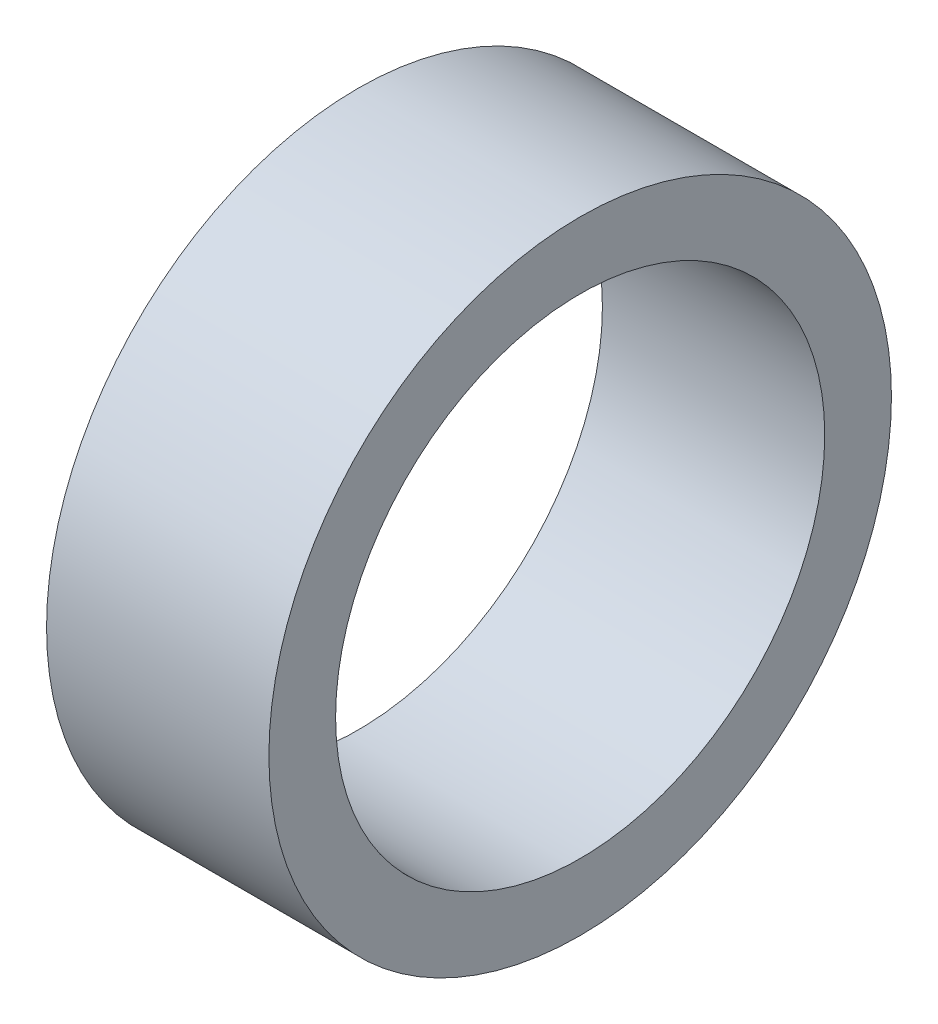
ISO-10303-21;
HEADER;
FILE_DESCRIPTION(('STEP AP214'),'2;1');
FILE_NAME('part.step','',(''),(''),'','','');
FILE_SCHEMA(('AUTOMOTIVE_DESIGN { 1 0 10303 214 1 1 1 1 }'));
ENDSEC;
DATA;
#1=APPLICATION_CONTEXT('core data for automotive mechanical design processes');
#2=APPLICATION_PROTOCOL_DEFINITION('international standard','automotive_design',2000,#1);
#3=PRODUCT_CONTEXT('',#1,'mechanical');
#4=PRODUCT('Part','Part','',(#3));
#5=PRODUCT_RELATED_PRODUCT_CATEGORY('part','',(#4));
#6=PRODUCT_DEFINITION_FORMATION('','',#4);
#7=PRODUCT_DEFINITION_CONTEXT('part definition',#1,'design');
#8=PRODUCT_DEFINITION('design','',#6,#7);
#9=PRODUCT_DEFINITION_SHAPE('','',#8);
#10=(LENGTH_UNIT() NAMED_UNIT(*) SI_UNIT(.MILLI.,.METRE.));
#11=(NAMED_UNIT(*) PLANE_ANGLE_UNIT() SI_UNIT($,.RADIAN.));
#12=(NAMED_UNIT(*) SI_UNIT($,.STERADIAN.) SOLID_ANGLE_UNIT());
#13=UNCERTAINTY_MEASURE_WITH_UNIT(LENGTH_MEASURE(1.E-05),#10,'distance_accuracy_value','');
#14=(GEOMETRIC_REPRESENTATION_CONTEXT(3) GLOBAL_UNCERTAINTY_ASSIGNED_CONTEXT((#13)) GLOBAL_UNIT_ASSIGNED_CONTEXT((#10,
#11,#12)) REPRESENTATION_CONTEXT('',''));
#15=CARTESIAN_POINT('',(0.,0.,0.));
#16=DIRECTION('',(0.,0.,1.));
#17=DIRECTION('',(1.,0.,0.));
#18=AXIS2_PLACEMENT_3D('',#15,#16,#17);
#19=CARTESIAN_POINT('',(3.175,0.,0.));
#20=DIRECTION('',(1.,0.,0.));
#21=DIRECTION('',(0.,0.,-1.));
#22=AXIS2_PLACEMENT_3D('',#19,#20,#21);
#23=PLANE('',#22);
#24=CARTESIAN_POINT('',(3.175,0.,0.));
#25=DIRECTION('',(1.,0.,0.));
#26=DIRECTION('',(0.,0.,-1.));
#27=AXIS2_PLACEMENT_3D('',#24,#25,#26);
#28=CIRCLE('',#27,4.445);
#29=CARTESIAN_POINT('',(3.175,0.,-4.445));
#30=VERTEX_POINT('',#29);
#31=EDGE_CURVE('E12',#30,#30,#28,.T.);
#32=ORIENTED_EDGE('',*,*,#31,.T.);
#33=EDGE_LOOP('',(#32));
#34=FACE_BOUND('',#33,.T.);
#35=CARTESIAN_POINT('',(3.175,0.,0.));
#36=DIRECTION('',(1.,0.,0.));
#37=DIRECTION('',(0.,0.,-1.));
#38=AXIS2_PLACEMENT_3D('',#35,#36,#37);
#39=CIRCLE('',#38,3.4925);
#40=CARTESIAN_POINT('',(3.175,0.,-3.4925));
#41=VERTEX_POINT('',#40);
#42=EDGE_CURVE('E51',#41,#41,#39,.T.);
#43=ORIENTED_EDGE('',*,*,#42,.F.);
#44=EDGE_LOOP('',(#43));
#45=FACE_BOUND('',#44,.T.);
#46=ADVANCED_FACE('F40',(#34,#45),#23,.T.);
#47=CARTESIAN_POINT('',(0.,0.,0.));
#48=DIRECTION('',(1.,0.,0.));
#49=DIRECTION('',(0.,0.,-1.));
#50=AXIS2_PLACEMENT_3D('',#47,#48,#49);
#51=PLANE('',#50);
#52=CARTESIAN_POINT('',(0.,0.,0.));
#53=DIRECTION('',(1.,0.,0.));
#54=DIRECTION('',(0.,0.,-1.));
#55=AXIS2_PLACEMENT_3D('',#52,#53,#54);
#56=CIRCLE('',#55,4.445);
#57=CARTESIAN_POINT('',(0.,0.,-4.445));
#58=VERTEX_POINT('',#57);
#59=EDGE_CURVE('E44',#58,#58,#56,.T.);
#60=ORIENTED_EDGE('',*,*,#59,.F.);
#61=EDGE_LOOP('',(#60));
#62=FACE_BOUND('',#61,.T.);
#63=CARTESIAN_POINT('',(0.,0.,0.));
#64=DIRECTION('',(1.,0.,0.));
#65=DIRECTION('',(0.,0.,-1.));
#66=AXIS2_PLACEMENT_3D('',#63,#64,#65);
#67=CIRCLE('',#66,3.4925);
#68=CARTESIAN_POINT('',(0.,0.,-3.4925));
#69=VERTEX_POINT('',#68);
#70=EDGE_CURVE('E53',#69,#69,#67,.T.);
#71=ORIENTED_EDGE('',*,*,#70,.T.);
#72=EDGE_LOOP('',(#71));
#73=FACE_BOUND('',#72,.T.);
#74=ADVANCED_FACE('F63',(#62,#73),#51,.F.);
#75=CARTESIAN_POINT('',(3.175,0.,0.));
#76=DIRECTION('',(-1.,0.,0.));
#77=DIRECTION('',(0.,0.,1.));
#78=AXIS2_PLACEMENT_3D('',#75,#76,#77);
#79=CYLINDRICAL_SURFACE('',#78,4.445);
#80=ORIENTED_EDGE('',*,*,#31,.F.);
#81=EDGE_LOOP('',(#80));
#82=FACE_BOUND('',#81,.T.);
#83=ORIENTED_EDGE('',*,*,#59,.T.);
#84=EDGE_LOOP('',(#83));
#85=FACE_BOUND('',#84,.T.);
#86=ADVANCED_FACE('F42',(#82,#85),#79,.T.);
#87=CARTESIAN_POINT('',(3.175,0.,0.));
#88=DIRECTION('',(-1.,0.,0.));
#89=DIRECTION('',(0.,0.,1.));
#90=AXIS2_PLACEMENT_3D('',#87,#88,#89);
#91=CYLINDRICAL_SURFACE('',#90,3.4925);
#92=ORIENTED_EDGE('',*,*,#42,.T.);
#93=EDGE_LOOP('',(#92));
#94=FACE_BOUND('',#93,.T.);
#95=ORIENTED_EDGE('',*,*,#70,.F.);
#96=EDGE_LOOP('',(#95));
#97=FACE_BOUND('',#96,.T.);
#98=ADVANCED_FACE('F59',(#94,#97),#91,.F.);
#99=CLOSED_SHELL('',(#46,#74,#86,#98));
#100=MANIFOLD_SOLID_BREP('B2',#99);
#101=ADVANCED_BREP_SHAPE_REPRESENTATION('',(#18,#100),#14);
#102=SHAPE_DEFINITION_REPRESENTATION(#9,#101);
ENDSEC;
END-ISO-10303-21;
